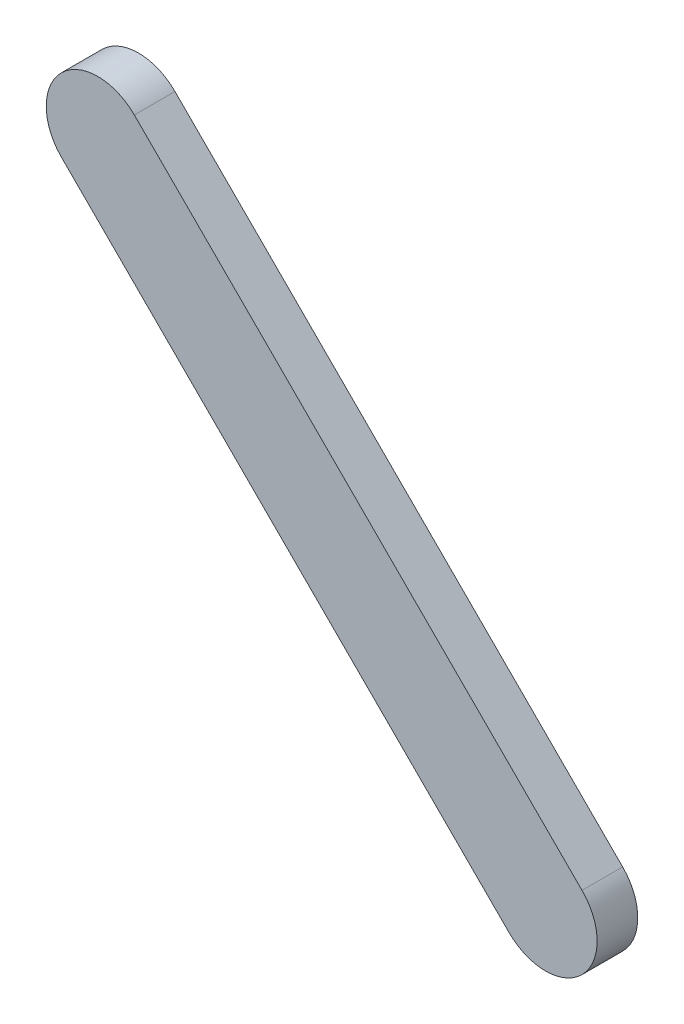
ISO-10303-21;
HEADER;
FILE_DESCRIPTION(('STEP AP214'),'2;1');
FILE_NAME('part.step','',(''),(''),'','','');
FILE_SCHEMA(('AUTOMOTIVE_DESIGN { 1 0 10303 214 1 1 1 1 }'));
ENDSEC;
DATA;
#1=APPLICATION_CONTEXT('core data for automotive mechanical design processes');
#2=APPLICATION_PROTOCOL_DEFINITION('international standard','automotive_design',2000,#1);
#3=PRODUCT_CONTEXT('',#1,'mechanical');
#4=PRODUCT('Part','Part','',(#3));
#5=PRODUCT_RELATED_PRODUCT_CATEGORY('part','',(#4));
#6=PRODUCT_DEFINITION_FORMATION('','',#4);
#7=PRODUCT_DEFINITION_CONTEXT('part definition',#1,'design');
#8=PRODUCT_DEFINITION('design','',#6,#7);
#9=PRODUCT_DEFINITION_SHAPE('','',#8);
#10=(LENGTH_UNIT() NAMED_UNIT(*) SI_UNIT(.MILLI.,.METRE.));
#11=(NAMED_UNIT(*) PLANE_ANGLE_UNIT() SI_UNIT($,.RADIAN.));
#12=(NAMED_UNIT(*) SI_UNIT($,.STERADIAN.) SOLID_ANGLE_UNIT());
#13=UNCERTAINTY_MEASURE_WITH_UNIT(LENGTH_MEASURE(1.E-05),#10,'distance_accuracy_value','');
#14=(GEOMETRIC_REPRESENTATION_CONTEXT(3) GLOBAL_UNCERTAINTY_ASSIGNED_CONTEXT((#13)) GLOBAL_UNIT_ASSIGNED_CONTEXT((#10,
#11,#12)) REPRESENTATION_CONTEXT('',''));
#15=CARTESIAN_POINT('',(0.,0.,0.));
#16=DIRECTION('',(0.,0.,1.));
#17=DIRECTION('',(1.,0.,0.));
#18=AXIS2_PLACEMENT_3D('',#15,#16,#17);
#19=CARTESIAN_POINT('',(131.26539406,66.26039326,0.));
#20=DIRECTION('',(0.707106781186548,0.707106781186548,0.));
#21=DIRECTION('',(0.707106781186548,-0.707106781186548,0.));
#22=AXIS2_PLACEMENT_3D('',#19,#20,#21);
#23=PLANE('',#22);
#24=DIRECTION('',(0.707106781186548,-0.707106781186548,0.));
#25=VECTOR('',#24,1.);
#26=CARTESIAN_POINT('',(131.26539406,66.26039326,0.1999996));
#27=LINE('',#26,#25);
#28=CARTESIAN_POINT('',(131.26539406,66.26039326,0.1999996));
#29=VERTEX_POINT('',#28);
#30=CARTESIAN_POINT('',(133.46879326,64.05699406,0.1999996));
#31=VERTEX_POINT('',#30);
#32=EDGE_CURVE('E11',#29,#31,#27,.T.);
#33=ORIENTED_EDGE('',*,*,#32,.F.);
#34=DIRECTION('',(0.,0.,1.));
#35=VECTOR('',#34,1.);
#36=CARTESIAN_POINT('',(131.26539406,66.26039326,0.));
#37=LINE('',#36,#35);
#38=CARTESIAN_POINT('',(131.26539406,66.26039326,0.));
#39=VERTEX_POINT('',#38);
#40=EDGE_CURVE('E24',#39,#29,#37,.T.);
#41=ORIENTED_EDGE('',*,*,#40,.F.);
#42=DIRECTION('',(0.707106781186548,-0.707106781186548,0.));
#43=VECTOR('',#42,1.);
#44=CARTESIAN_POINT('',(131.26539406,66.26039326,0.));
#45=LINE('',#44,#43);
#46=CARTESIAN_POINT('',(133.46879326,64.05699406,0.));
#47=VERTEX_POINT('',#46);
#48=EDGE_CURVE('E75',#39,#47,#45,.T.);
#49=ORIENTED_EDGE('',*,*,#48,.T.);
#50=DIRECTION('',(0.,0.,1.));
#51=VECTOR('',#50,1.);
#52=CARTESIAN_POINT('',(133.46879326,64.05699406,0.));
#53=LINE('',#52,#51);
#54=EDGE_CURVE('E37',#47,#31,#53,.T.);
#55=ORIENTED_EDGE('',*,*,#54,.T.);
#56=EDGE_LOOP('',(#33,#41,#49,#55));
#57=FACE_BOUND('',#56,.T.);
#58=ADVANCED_FACE('F17',(#57),#23,.F.);
#59=CARTESIAN_POINT('',(133.6483992,64.2366,0.));
#60=DIRECTION('',(0.,0.,-1.));
#61=DIRECTION('',(-0.70710678118652,-0.707106781186576,0.));
#62=AXIS2_PLACEMENT_3D('',#59,#60,#61);
#63=CYLINDRICAL_SURFACE('',#62,0.254001156230774);
#64=CARTESIAN_POINT('',(133.6483992,64.2366,0.1999996));
#65=DIRECTION('',(0.,0.,1.));
#66=DIRECTION('',(-0.70710678118652,-0.707106781186576,0.));
#67=AXIS2_PLACEMENT_3D('',#64,#65,#66);
#68=CIRCLE('',#67,0.254001156230774);
#69=CARTESIAN_POINT('',(133.82800514,64.41620594,0.1999996));
#70=VERTEX_POINT('',#69);
#71=EDGE_CURVE('E83',#31,#70,#68,.T.);
#72=ORIENTED_EDGE('',*,*,#71,.F.);
#73=ORIENTED_EDGE('',*,*,#54,.F.);
#74=CARTESIAN_POINT('',(133.6483992,64.2366,0.));
#75=DIRECTION('',(0.,0.,1.));
#76=DIRECTION('',(-0.70710678118652,-0.707106781186576,0.));
#77=AXIS2_PLACEMENT_3D('',#74,#75,#76);
#78=CIRCLE('',#77,0.254001156230774);
#79=CARTESIAN_POINT('',(133.82800514,64.41620594,0.));
#80=VERTEX_POINT('',#79);
#81=EDGE_CURVE('E81',#47,#80,#78,.T.);
#82=ORIENTED_EDGE('',*,*,#81,.T.);
#83=DIRECTION('',(0.,0.,1.));
#84=VECTOR('',#83,1.);
#85=CARTESIAN_POINT('',(133.82800514,64.41620594,0.));
#86=LINE('',#85,#84);
#87=EDGE_CURVE('E67',#80,#70,#86,.T.);
#88=ORIENTED_EDGE('',*,*,#87,.T.);
#89=EDGE_LOOP('',(#72,#73,#82,#88));
#90=FACE_BOUND('',#89,.T.);
#91=ADVANCED_FACE('F89',(#90),#63,.T.);
#92=CARTESIAN_POINT('',(133.82800514,64.41620594,0.));
#93=DIRECTION('',(-0.707106781186548,-0.707106781186548,0.));
#94=DIRECTION('',(-0.707106781186548,0.707106781186548,0.));
#95=AXIS2_PLACEMENT_3D('',#92,#93,#94);
#96=PLANE('',#95);
#97=DIRECTION('',(-0.707106781186548,0.707106781186548,0.));
#98=VECTOR('',#97,1.);
#99=CARTESIAN_POINT('',(133.82800514,64.41620594,0.1999996));
#100=LINE('',#99,#98);
#101=CARTESIAN_POINT('',(131.62460594,66.61960514,0.1999996));
#102=VERTEX_POINT('',#101);
#103=EDGE_CURVE('E71',#70,#102,#100,.T.);
#104=ORIENTED_EDGE('',*,*,#103,.F.);
#105=ORIENTED_EDGE('',*,*,#87,.F.);
#106=DIRECTION('',(-0.707106781186548,0.707106781186548,0.));
#107=VECTOR('',#106,1.);
#108=CARTESIAN_POINT('',(133.82800514,64.41620594,0.));
#109=LINE('',#108,#107);
#110=CARTESIAN_POINT('',(131.62460594,66.61960514,0.));
#111=VERTEX_POINT('',#110);
#112=EDGE_CURVE('E63',#80,#111,#109,.T.);
#113=ORIENTED_EDGE('',*,*,#112,.T.);
#114=DIRECTION('',(0.,0.,1.));
#115=VECTOR('',#114,1.);
#116=CARTESIAN_POINT('',(131.62460594,66.61960514,0.));
#117=LINE('',#116,#115);
#118=EDGE_CURVE('E53',#111,#102,#117,.T.);
#119=ORIENTED_EDGE('',*,*,#118,.T.);
#120=EDGE_LOOP('',(#104,#105,#113,#119));
#121=FACE_BOUND('',#120,.T.);
#122=ADVANCED_FACE('F66',(#121),#96,.F.);
#123=CARTESIAN_POINT('',(131.445,66.4399992,0.));
#124=DIRECTION('',(0.,0.,-1.));
#125=DIRECTION('',(0.70710678118652,0.707106781186576,0.));
#126=AXIS2_PLACEMENT_3D('',#123,#124,#125);
#127=CYLINDRICAL_SURFACE('',#126,0.254001156230774);
#128=CARTESIAN_POINT('',(131.445,66.4399992,0.1999996));
#129=DIRECTION('',(0.,0.,1.));
#130=DIRECTION('',(0.70710678118652,0.707106781186576,0.));
#131=AXIS2_PLACEMENT_3D('',#128,#129,#130);
#132=CIRCLE('',#131,0.254001156230774);
#133=EDGE_CURVE('E59',#102,#29,#132,.T.);
#134=ORIENTED_EDGE('',*,*,#133,.F.);
#135=ORIENTED_EDGE('',*,*,#118,.F.);
#136=CARTESIAN_POINT('',(131.445,66.4399992,0.));
#137=DIRECTION('',(0.,0.,1.));
#138=DIRECTION('',(0.70710678118652,0.707106781186576,0.));
#139=AXIS2_PLACEMENT_3D('',#136,#137,#138);
#140=CIRCLE('',#139,0.254001156230774);
#141=EDGE_CURVE('E57',#111,#39,#140,.T.);
#142=ORIENTED_EDGE('',*,*,#141,.T.);
#143=ORIENTED_EDGE('',*,*,#40,.T.);
#144=EDGE_LOOP('',(#134,#135,#142,#143));
#145=FACE_BOUND('',#144,.T.);
#146=ADVANCED_FACE('F55',(#145),#127,.T.);
#147=CARTESIAN_POINT('',(131.26539406,66.26039326,0.));
#148=DIRECTION('',(0.,0.,-1.));
#149=DIRECTION('',(-1.,0.,0.));
#150=AXIS2_PLACEMENT_3D('',#147,#148,#149);
#151=PLANE('',#150);
#152=ORIENTED_EDGE('',*,*,#141,.F.);
#153=ORIENTED_EDGE('',*,*,#112,.F.);
#154=ORIENTED_EDGE('',*,*,#81,.F.);
#155=ORIENTED_EDGE('',*,*,#48,.F.);
#156=EDGE_LOOP('',(#152,#153,#154,#155));
#157=FACE_BOUND('',#156,.T.);
#158=ADVANCED_FACE('F74',(#157),#151,.T.);
#159=CARTESIAN_POINT('',(131.26539406,66.26039326,0.1999996));
#160=DIRECTION('',(0.,0.,-1.));
#161=DIRECTION('',(-1.,0.,0.));
#162=AXIS2_PLACEMENT_3D('',#159,#160,#161);
#163=PLANE('',#162);
#164=ORIENTED_EDGE('',*,*,#32,.T.);
#165=ORIENTED_EDGE('',*,*,#71,.T.);
#166=ORIENTED_EDGE('',*,*,#103,.T.);
#167=ORIENTED_EDGE('',*,*,#133,.T.);
#168=EDGE_LOOP('',(#164,#165,#166,#167));
#169=FACE_BOUND('',#168,.T.);
#170=ADVANCED_FACE('F91',(#169),#163,.F.);
#171=CLOSED_SHELL('',(#58,#91,#122,#146,#158,#170));
#172=MANIFOLD_SOLID_BREP('B1',#171);
#173=ADVANCED_BREP_SHAPE_REPRESENTATION('',(#18,#172),#14);
#174=SHAPE_DEFINITION_REPRESENTATION(#9,#173);
ENDSEC;
END-ISO-10303-21;
